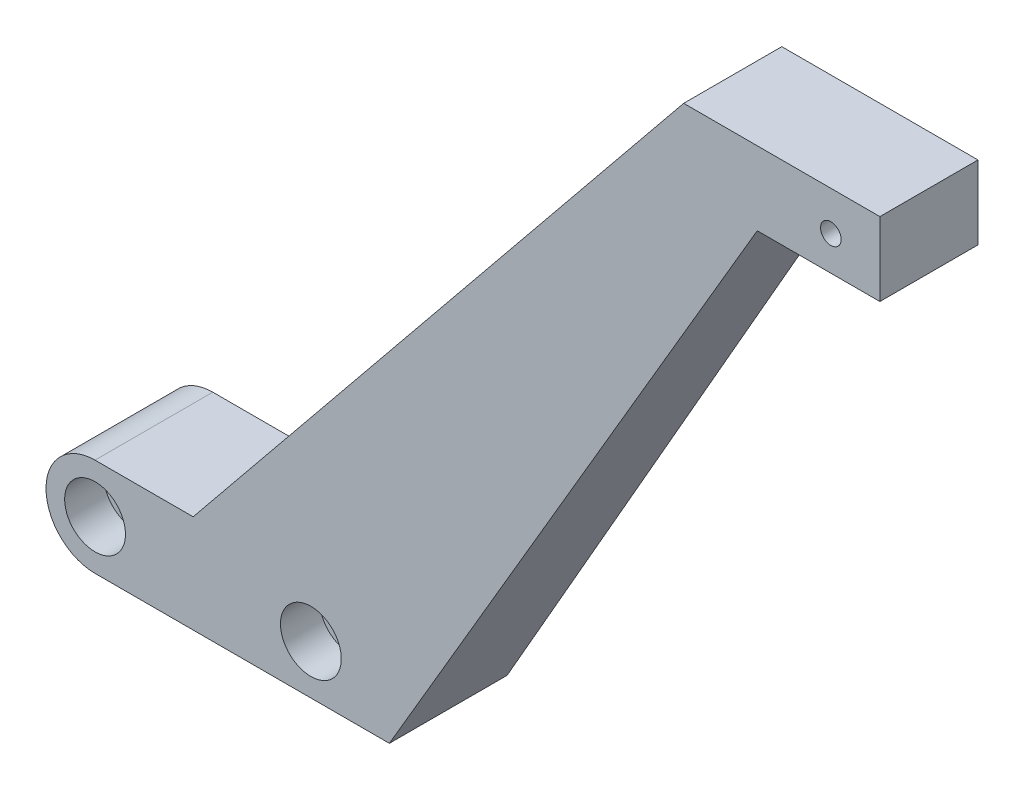
ISO-10303-21;
HEADER;
FILE_DESCRIPTION(('STEP AP214'),'2;1');
FILE_NAME('part.step','',(''),(''),'','','');
FILE_SCHEMA(('AUTOMOTIVE_DESIGN { 1 0 10303 214 1 1 1 1 }'));
ENDSEC;
DATA;
#1=APPLICATION_CONTEXT('core data for automotive mechanical design processes');
#2=APPLICATION_PROTOCOL_DEFINITION('international standard','automotive_design',2000,#1);
#3=PRODUCT_CONTEXT('',#1,'mechanical');
#4=PRODUCT('Part','Part','',(#3));
#5=PRODUCT_RELATED_PRODUCT_CATEGORY('part','',(#4));
#6=PRODUCT_DEFINITION_FORMATION('','',#4);
#7=PRODUCT_DEFINITION_CONTEXT('part definition',#1,'design');
#8=PRODUCT_DEFINITION('design','',#6,#7);
#9=PRODUCT_DEFINITION_SHAPE('','',#8);
#10=(LENGTH_UNIT() NAMED_UNIT(*) SI_UNIT(.MILLI.,.METRE.));
#11=(NAMED_UNIT(*) PLANE_ANGLE_UNIT() SI_UNIT($,.RADIAN.));
#12=(NAMED_UNIT(*) SI_UNIT($,.STERADIAN.) SOLID_ANGLE_UNIT());
#13=UNCERTAINTY_MEASURE_WITH_UNIT(LENGTH_MEASURE(1.E-05),#10,'distance_accuracy_value','');
#14=(GEOMETRIC_REPRESENTATION_CONTEXT(3) GLOBAL_UNCERTAINTY_ASSIGNED_CONTEXT((#13)) GLOBAL_UNIT_ASSIGNED_CONTEXT((#10,
#11,#12)) REPRESENTATION_CONTEXT('',''));
#15=CARTESIAN_POINT('',(0.,0.,0.));
#16=DIRECTION('',(0.,0.,1.));
#17=DIRECTION('',(1.,0.,0.));
#18=AXIS2_PLACEMENT_3D('',#15,#16,#17);
#19=CARTESIAN_POINT('',(-8.,0.,-10.5254833995939));
#20=DIRECTION('',(0.,0.,1.));
#21=DIRECTION('',(-1.,0.,0.));
#22=AXIS2_PLACEMENT_3D('',#19,#20,#21);
#23=CYLINDRICAL_SURFACE('',#22,1.6);
#24=CARTESIAN_POINT('',(-8.,0.,-6.));
#25=DIRECTION('',(0.,0.,1.));
#26=DIRECTION('',(1.,0.,0.));
#27=AXIS2_PLACEMENT_3D('',#24,#25,#26);
#28=CIRCLE('',#27,1.6);
#29=CARTESIAN_POINT('',(-6.4,0.,-6.));
#30=VERTEX_POINT('',#29);
#31=EDGE_CURVE('E429',#30,#30,#28,.F.);
#32=ORIENTED_EDGE('',*,*,#31,.T.);
#33=EDGE_LOOP('',(#32));
#34=FACE_BOUND('',#33,.T.);
#35=CARTESIAN_POINT('',(-8.,0.,2.));
#36=DIRECTION('',(0.,0.,-1.));
#37=DIRECTION('',(-1.,0.,0.));
#38=AXIS2_PLACEMENT_3D('',#35,#36,#37);
#39=CIRCLE('',#38,1.6);
#40=CARTESIAN_POINT('',(-9.60000000000001,0.,2.));
#41=VERTEX_POINT('',#40);
#42=EDGE_CURVE('E70',#41,#41,#39,.F.);
#43=ORIENTED_EDGE('',*,*,#42,.T.);
#44=EDGE_LOOP('',(#43));
#45=FACE_BOUND('',#44,.T.);
#46=ADVANCED_FACE('F66',(#34,#45),#23,.F.);
#47=CARTESIAN_POINT('',(-30.,0.,-10.5254833995939));
#48=DIRECTION('',(0.,0.,1.));
#49=DIRECTION('',(-1.,0.,0.));
#50=AXIS2_PLACEMENT_3D('',#47,#48,#49);
#51=CYLINDRICAL_SURFACE('',#50,1.6);
#52=CARTESIAN_POINT('',(-30.,0.,-6.));
#53=DIRECTION('',(0.,0.,1.));
#54=DIRECTION('',(1.,0.,0.));
#55=AXIS2_PLACEMENT_3D('',#52,#53,#54);
#56=CIRCLE('',#55,1.6);
#57=CARTESIAN_POINT('',(-28.4,0.,-6.));
#58=VERTEX_POINT('',#57);
#59=EDGE_CURVE('E327',#58,#58,#56,.F.);
#60=ORIENTED_EDGE('',*,*,#59,.T.);
#61=EDGE_LOOP('',(#60));
#62=FACE_BOUND('',#61,.T.);
#63=CARTESIAN_POINT('',(-30.,0.,2.));
#64=DIRECTION('',(0.,0.,-1.));
#65=DIRECTION('',(-1.,0.,0.));
#66=AXIS2_PLACEMENT_3D('',#63,#64,#65);
#67=CIRCLE('',#66,1.6);
#68=CARTESIAN_POINT('',(-31.6,0.,2.));
#69=VERTEX_POINT('',#68);
#70=EDGE_CURVE('E418',#69,#69,#67,.F.);
#71=ORIENTED_EDGE('',*,*,#70,.T.);
#72=EDGE_LOOP('',(#71));
#73=FACE_BOUND('',#72,.T.);
#74=ADVANCED_FACE('F379',(#62,#73),#51,.F.);
#75=CARTESIAN_POINT('',(-20.,-5.,6.));
#76=DIRECTION('',(0.,0.,1.));
#77=DIRECTION('',(-1.,0.,0.));
#78=AXIS2_PLACEMENT_3D('',#75,#76,#77);
#79=PLANE('',#78);
#80=CARTESIAN_POINT('',(-8.,0.,6.));
#81=DIRECTION('',(0.,0.,-1.));
#82=DIRECTION('',(-1.,0.,0.));
#83=AXIS2_PLACEMENT_3D('',#80,#81,#82);
#84=CIRCLE('',#83,3.1);
#85=CARTESIAN_POINT('',(-11.1,0.,6.));
#86=VERTEX_POINT('',#85);
#87=EDGE_CURVE('E432',#86,#86,#84,.T.);
#88=ORIENTED_EDGE('',*,*,#87,.T.);
#89=EDGE_LOOP('',(#88));
#90=FACE_BOUND('',#89,.T.);
#91=CARTESIAN_POINT('',(-30.,0.,6.));
#92=DIRECTION('',(0.,0.,-1.));
#93=DIRECTION('',(-1.,0.,0.));
#94=AXIS2_PLACEMENT_3D('',#91,#92,#93);
#95=CIRCLE('',#94,3.1);
#96=CARTESIAN_POINT('',(-33.1,0.,6.));
#97=VERTEX_POINT('',#96);
#98=EDGE_CURVE('E425',#97,#97,#95,.T.);
#99=ORIENTED_EDGE('',*,*,#98,.T.);
#100=EDGE_LOOP('',(#99));
#101=FACE_BOUND('',#100,.T.);
#102=CARTESIAN_POINT('',(45.,62.5,6.));
#103=DIRECTION('',(0.,0.,-1.));
#104=DIRECTION('',(-1.,0.,0.));
#105=AXIS2_PLACEMENT_3D('',#102,#103,#104);
#106=CIRCLE('',#105,1.05);
#107=CARTESIAN_POINT('',(43.95,62.5,6.));
#108=VERTEX_POINT('',#107);
#109=EDGE_CURVE('E161',#108,#108,#106,.T.);
#110=ORIENTED_EDGE('',*,*,#109,.T.);
#111=EDGE_LOOP('',(#110));
#112=FACE_BOUND('',#111,.T.);
#113=DIRECTION('',(1.,0.,0.));
#114=VECTOR('',#113,1.);
#115=CARTESIAN_POINT('',(-20.,-5.,6.));
#116=LINE('',#115,#114);
#117=CARTESIAN_POINT('',(-30.,-5.,6.));
#118=VERTEX_POINT('',#117);
#119=CARTESIAN_POINT('',(0.,-5.,6.));
#120=VERTEX_POINT('',#119);
#121=EDGE_CURVE('E244',#118,#120,#116,.T.);
#122=ORIENTED_EDGE('',*,*,#121,.T.);
#123=DIRECTION('',(0.505546500182335,0.862799360311186,0.));
#124=VECTOR('',#123,1.);
#125=CARTESIAN_POINT('',(0.,-5.,6.));
#126=LINE('',#125,#124);
#127=CARTESIAN_POINT('',(37.5,59.,6.));
#128=VERTEX_POINT('',#127);
#129=EDGE_CURVE('E339',#120,#128,#126,.T.);
#130=ORIENTED_EDGE('',*,*,#129,.T.);
#131=DIRECTION('',(-1.,0.,0.));
#132=VECTOR('',#131,1.);
#133=CARTESIAN_POINT('',(62.5,59.,6.));
#134=LINE('',#133,#132);
#135=CARTESIAN_POINT('',(50.,59.,6.));
#136=VERTEX_POINT('',#135);
#137=EDGE_CURVE('E303',#136,#128,#134,.T.);
#138=ORIENTED_EDGE('',*,*,#137,.F.);
#139=DIRECTION('',(0.,1.,0.));
#140=VECTOR('',#139,1.);
#141=CARTESIAN_POINT('',(50.,59.,6.));
#142=LINE('',#141,#140);
#143=CARTESIAN_POINT('',(50.,66.5,6.));
#144=VERTEX_POINT('',#143);
#145=EDGE_CURVE('E290',#136,#144,#142,.T.);
#146=ORIENTED_EDGE('',*,*,#145,.T.);
#147=DIRECTION('',(-1.,0.,0.));
#148=VECTOR('',#147,1.);
#149=CARTESIAN_POINT('',(62.5,66.5,6.));
#150=LINE('',#149,#148);
#151=CARTESIAN_POINT('',(30.,66.5,6.));
#152=VERTEX_POINT('',#151);
#153=EDGE_CURVE('E168',#144,#152,#150,.T.);
#154=ORIENTED_EDGE('',*,*,#153,.T.);
#155=DIRECTION('',(0.63083008454486,0.775921003990177,0.));
#156=VECTOR('',#155,1.);
#157=CARTESIAN_POINT('',(-20.,5.,6.));
#158=LINE('',#157,#156);
#159=CARTESIAN_POINT('',(-20.,5.,6.));
#160=VERTEX_POINT('',#159);
#161=EDGE_CURVE('E148',#160,#152,#158,.T.);
#162=ORIENTED_EDGE('',*,*,#161,.F.);
#163=DIRECTION('',(1.,0.,0.));
#164=VECTOR('',#163,1.);
#165=CARTESIAN_POINT('',(-35.,5.,6.));
#166=LINE('',#165,#164);
#167=CARTESIAN_POINT('',(-30.,5.,6.));
#168=VERTEX_POINT('',#167);
#169=EDGE_CURVE('E157',#168,#160,#166,.T.);
#170=ORIENTED_EDGE('',*,*,#169,.F.);
#171=CARTESIAN_POINT('',(-30.,0.,6.));
#172=DIRECTION('',(0.,0.,-1.));
#173=DIRECTION('',(-1.,0.,0.));
#174=AXIS2_PLACEMENT_3D('',#171,#172,#173);
#175=CIRCLE('',#174,5.);
#176=CARTESIAN_POINT('',(-35.,0.,6.));
#177=VERTEX_POINT('',#176);
#178=EDGE_CURVE('E410',#177,#168,#175,.T.);
#179=ORIENTED_EDGE('',*,*,#178,.F.);
#180=CARTESIAN_POINT('',(-30.,0.,6.));
#181=DIRECTION('',(0.,0.,-1.));
#182=DIRECTION('',(-1.,0.,0.));
#183=AXIS2_PLACEMENT_3D('',#180,#181,#182);
#184=CIRCLE('',#183,5.);
#185=EDGE_CURVE('E75',#118,#177,#184,.T.);
#186=ORIENTED_EDGE('',*,*,#185,.F.);
#187=EDGE_LOOP('',(#122,#130,#138,#146,#154,#162,#170,#179,#186));
#188=FACE_BOUND('',#187,.T.);
#189=ADVANCED_FACE('F165',(#90,#101,#112,#188),#79,.T.);
#190=CARTESIAN_POINT('',(-20.,-5.,-6.));
#191=DIRECTION('',(0.,-1.,0.));
#192=DIRECTION('',(0.,0.,1.));
#193=AXIS2_PLACEMENT_3D('',#190,#191,#192);
#194=PLANE('',#193);
#195=DIRECTION('',(1.,0.,0.));
#196=VECTOR('',#195,1.);
#197=CARTESIAN_POINT('',(-20.,-5.,-6.));
#198=LINE('',#197,#196);
#199=CARTESIAN_POINT('',(-30.,-5.,-6.));
#200=VERTEX_POINT('',#199);
#201=CARTESIAN_POINT('',(0.,-5.00000000000001,-6.));
#202=VERTEX_POINT('',#201);
#203=EDGE_CURVE('E321',#200,#202,#198,.T.);
#204=ORIENTED_EDGE('',*,*,#203,.T.);
#205=DIRECTION('',(0.,0.,-1.));
#206=VECTOR('',#205,1.);
#207=CARTESIAN_POINT('',(0.,-5.,0.));
#208=LINE('',#207,#206);
#209=EDGE_CURVE('E154',#202,#120,#208,.F.);
#210=ORIENTED_EDGE('',*,*,#209,.T.);
#211=ORIENTED_EDGE('',*,*,#121,.F.);
#212=DIRECTION('',(0.,0.,-1.));
#213=VECTOR('',#212,1.);
#214=CARTESIAN_POINT('',(-30.,-5.,-6.));
#215=LINE('',#214,#213);
#216=EDGE_CURVE('E412',#200,#118,#215,.F.);
#217=ORIENTED_EDGE('',*,*,#216,.F.);
#218=EDGE_LOOP('',(#204,#210,#211,#217));
#219=FACE_BOUND('',#218,.T.);
#220=ADVANCED_FACE('F214',(#219),#194,.T.);
#221=CARTESIAN_POINT('',(-20.,-5.,-6.));
#222=DIRECTION('',(0.,0.,-1.));
#223=DIRECTION('',(1.,0.,0.));
#224=AXIS2_PLACEMENT_3D('',#221,#222,#223);
#225=PLANE('',#224);
#226=ORIENTED_EDGE('',*,*,#31,.F.);
#227=EDGE_LOOP('',(#226));
#228=FACE_BOUND('',#227,.T.);
#229=ORIENTED_EDGE('',*,*,#59,.F.);
#230=EDGE_LOOP('',(#229));
#231=FACE_BOUND('',#230,.T.);
#232=CARTESIAN_POINT('',(-30.,0.,-6.));
#233=DIRECTION('',(0.,0.,1.));
#234=DIRECTION('',(1.,0.,0.));
#235=AXIS2_PLACEMENT_3D('',#232,#233,#234);
#236=CIRCLE('',#235,5.);
#237=CARTESIAN_POINT('',(-30.,5.00000000000001,-6.));
#238=VERTEX_POINT('',#237);
#239=CARTESIAN_POINT('',(-35.,0.,-6.));
#240=VERTEX_POINT('',#239);
#241=EDGE_CURVE('E325',#238,#240,#236,.T.);
#242=ORIENTED_EDGE('',*,*,#241,.F.);
#243=DIRECTION('',(1.,0.,0.));
#244=VECTOR('',#243,1.);
#245=CARTESIAN_POINT('',(-35.,5.00000000000001,-6.));
#246=LINE('',#245,#244);
#247=CARTESIAN_POINT('',(-20.,5.00000000000001,-6.));
#248=VERTEX_POINT('',#247);
#249=EDGE_CURVE('E162',#238,#248,#246,.T.);
#250=ORIENTED_EDGE('',*,*,#249,.T.);
#251=DIRECTION('',(1.,0.,0.));
#252=VECTOR('',#251,1.);
#253=CARTESIAN_POINT('',(-20.,5.,-6.));
#254=LINE('',#253,#252);
#255=CARTESIAN_POINT('',(0.,5.,-6.));
#256=VERTEX_POINT('',#255);
#257=EDGE_CURVE('E153',#248,#256,#254,.T.);
#258=ORIENTED_EDGE('',*,*,#257,.T.);
#259=DIRECTION('',(0.,1.,0.));
#260=VECTOR('',#259,1.);
#261=CARTESIAN_POINT('',(0.,-5.,-6.));
#262=LINE('',#261,#260);
#263=EDGE_CURVE('E314',#256,#202,#262,.F.);
#264=ORIENTED_EDGE('',*,*,#263,.T.);
#265=ORIENTED_EDGE('',*,*,#203,.F.);
#266=CARTESIAN_POINT('',(-30.,0.,-6.));
#267=DIRECTION('',(0.,0.,1.));
#268=DIRECTION('',(1.,0.,0.));
#269=AXIS2_PLACEMENT_3D('',#266,#267,#268);
#270=CIRCLE('',#269,5.);
#271=EDGE_CURVE('E415',#240,#200,#270,.T.);
#272=ORIENTED_EDGE('',*,*,#271,.F.);
#273=EDGE_LOOP('',(#242,#250,#258,#264,#265,#272));
#274=FACE_BOUND('',#273,.T.);
#275=ADVANCED_FACE('F202',(#228,#231,#274),#225,.T.);
#276=CARTESIAN_POINT('',(-20.,5.,-6.));
#277=CARTESIAN_POINT('',(30.,66.5,-4.));
#278=CARTESIAN_POINT('',(-16.6666666666667,5.,-6.));
#279=CARTESIAN_POINT('',(30.,65.2500000000001,-4.));
#280=CARTESIAN_POINT('',(-13.3333333333334,5.,-6.));
#281=CARTESIAN_POINT('',(30.,64.0000000000001,-4.));
#282=CARTESIAN_POINT('',(-6.66666666666669,5.,-6.));
#283=CARTESIAN_POINT('',(30.,61.5000000000001,-4.));
#284=CARTESIAN_POINT('',(-3.33333333333335,5.,-6.));
#285=CARTESIAN_POINT('',(30.,60.2500000000001,-4.));
#286=CARTESIAN_POINT('',(0.,5.,-6.));
#287=CARTESIAN_POINT('',(30.,59.,-4.));
#288=B_SPLINE_SURFACE_WITH_KNOTS('',3,1,((#276,#277),(#278,#279),(#280,#281),(#282,#283),(#284,
#285),(#286,#287)),.UNSPECIFIED.,.F.,.F.,.F.,(4,2,4),(2,2),(0.,0.5,1.),(0.,1.),.UNSPECIFIED.);
#289=DIRECTION('',(-0.630629351049608,-0.775674101791018,-0.0252251740419843));
#290=VECTOR('',#289,1.);
#291=CARTESIAN_POINT('',(5.,35.75,-5.));
#292=LINE('',#291,#290);
#293=CARTESIAN_POINT('',(30.,66.5,-4.));
#294=VERTEX_POINT('',#293);
#295=EDGE_CURVE('E151',#294,#248,#292,.T.);
#296=DIRECTION('',(0.,1.,0.));
#297=VECTOR('',#296,1.);
#298=CARTESIAN_POINT('',(30.,0.,-4.));
#299=LINE('',#298,#297);
#300=CARTESIAN_POINT('',(30.,59.,-4.));
#301=VERTEX_POINT('',#300);
#302=EDGE_CURVE('E172',#301,#294,#299,.T.);
#303=DIRECTION('',(0.48538860126793,0.873699482282274,0.0323592400845287));
#304=VECTOR('',#303,1.);
#305=CARTESIAN_POINT('',(15.,32.,-5.));
#306=LINE('',#305,#304);
#307=EDGE_CURVE('E170',#256,#301,#306,.T.);
#308=ORIENTED_EDGE('',*,*,#257,.F.);
#309=ORIENTED_EDGE('',*,*,#295,.F.);
#310=ORIENTED_EDGE('',*,*,#302,.F.);
#311=ORIENTED_EDGE('',*,*,#307,.F.);
#312=EDGE_LOOP('',(#308,#309,#310,#311));
#313=FACE_BOUND('',#312,.T.);
#314=ADVANCED_FACE('F190',(#313),#288,.F.);
#315=CARTESIAN_POINT('',(-14.4884396513988,11.7792192287795,0.));
#316=DIRECTION('',(-0.775921003990177,0.63083008454486,0.));
#317=DIRECTION('',(-0.63083008454486,-0.775921003990177,0.));
#318=AXIS2_PLACEMENT_3D('',#315,#316,#317);
#319=PLANE('',#318);
#320=ORIENTED_EDGE('',*,*,#295,.T.);
#321=DIRECTION('',(0.,0.,-1.));
#322=VECTOR('',#321,1.);
#323=CARTESIAN_POINT('',(-20.,5.00000000000001,0.));
#324=LINE('',#323,#322);
#325=EDGE_CURVE('E144',#160,#248,#324,.T.);
#326=ORIENTED_EDGE('',*,*,#325,.F.);
#327=ORIENTED_EDGE('',*,*,#161,.T.);
#328=DIRECTION('',(0.,0.,1.));
#329=VECTOR('',#328,1.);
#330=CARTESIAN_POINT('',(30.,66.5,0.));
#331=LINE('',#330,#329);
#332=EDGE_CURVE('E169',#294,#152,#331,.T.);
#333=ORIENTED_EDGE('',*,*,#332,.F.);
#334=EDGE_LOOP('',(#320,#326,#327,#333));
#335=FACE_BOUND('',#334,.T.);
#336=ADVANCED_FACE('F145',(#335),#319,.T.);
#337=CARTESIAN_POINT('',(62.5,66.5,-4.));
#338=DIRECTION('',(0.,0.,1.));
#339=DIRECTION('',(-1.,0.,0.));
#340=AXIS2_PLACEMENT_3D('',#337,#338,#339);
#341=PLANE('',#340);
#342=CARTESIAN_POINT('',(45.,62.5,-4.));
#343=DIRECTION('',(0.,0.,-1.));
#344=DIRECTION('',(-1.,0.,0.));
#345=AXIS2_PLACEMENT_3D('',#342,#343,#344);
#346=CIRCLE('',#345,1.05);
#347=CARTESIAN_POINT('',(43.95,62.5,-4.));
#348=VERTEX_POINT('',#347);
#349=EDGE_CURVE('E334',#348,#348,#346,.F.);
#350=ORIENTED_EDGE('',*,*,#349,.T.);
#351=EDGE_LOOP('',(#350));
#352=FACE_BOUND('',#351,.T.);
#353=DIRECTION('',(0.,-1.,0.));
#354=VECTOR('',#353,1.);
#355=CARTESIAN_POINT('',(50.,66.5,-4.));
#356=LINE('',#355,#354);
#357=CARTESIAN_POINT('',(50.,66.5,-4.));
#358=VERTEX_POINT('',#357);
#359=CARTESIAN_POINT('',(50.,59.,-4.));
#360=VERTEX_POINT('',#359);
#361=EDGE_CURVE('E294',#358,#360,#356,.T.);
#362=ORIENTED_EDGE('',*,*,#361,.T.);
#363=DIRECTION('',(-1.,0.,0.));
#364=VECTOR('',#363,1.);
#365=CARTESIAN_POINT('',(62.5,59.,-4.));
#366=LINE('',#365,#364);
#367=CARTESIAN_POINT('',(37.5,59.,-4.));
#368=VERTEX_POINT('',#367);
#369=EDGE_CURVE('E305',#360,#368,#366,.T.);
#370=ORIENTED_EDGE('',*,*,#369,.T.);
#371=DIRECTION('',(-1.,0.,0.));
#372=VECTOR('',#371,1.);
#373=CARTESIAN_POINT('',(30.,59.,-4.));
#374=LINE('',#373,#372);
#375=EDGE_CURVE('E272',#368,#301,#374,.T.);
#376=ORIENTED_EDGE('',*,*,#375,.T.);
#377=ORIENTED_EDGE('',*,*,#302,.T.);
#378=DIRECTION('',(-1.,0.,0.));
#379=VECTOR('',#378,1.);
#380=CARTESIAN_POINT('',(62.5,66.5,-4.));
#381=LINE('',#380,#379);
#382=EDGE_CURVE('E280',#358,#294,#381,.T.);
#383=ORIENTED_EDGE('',*,*,#382,.F.);
#384=EDGE_LOOP('',(#362,#370,#376,#377,#383));
#385=FACE_BOUND('',#384,.T.);
#386=ADVANCED_FACE('F213',(#352,#385),#341,.F.);
#387=CARTESIAN_POINT('',(62.5,59.,-4.));
#388=DIRECTION('',(0.,1.,0.));
#389=DIRECTION('',(0.,0.,-1.));
#390=AXIS2_PLACEMENT_3D('',#387,#388,#389);
#391=PLANE('',#390);
#392=ORIENTED_EDGE('',*,*,#369,.F.);
#393=DIRECTION('',(0.,0.,1.));
#394=VECTOR('',#393,1.);
#395=CARTESIAN_POINT('',(50.,59.,-4.));
#396=LINE('',#395,#394);
#397=EDGE_CURVE('E292',#360,#136,#396,.T.);
#398=ORIENTED_EDGE('',*,*,#397,.T.);
#399=ORIENTED_EDGE('',*,*,#137,.T.);
#400=DIRECTION('',(0.,0.,-1.));
#401=VECTOR('',#400,1.);
#402=CARTESIAN_POINT('',(37.5,59.,-4.));
#403=LINE('',#402,#401);
#404=EDGE_CURVE('E238',#128,#368,#403,.T.);
#405=ORIENTED_EDGE('',*,*,#404,.T.);
#406=EDGE_LOOP('',(#392,#398,#399,#405));
#407=FACE_BOUND('',#406,.T.);
#408=ADVANCED_FACE('F246',(#407),#391,.F.);
#409=CARTESIAN_POINT('',(62.5,66.5,6.));
#410=DIRECTION('',(0.,-1.,0.));
#411=DIRECTION('',(0.,0.,1.));
#412=AXIS2_PLACEMENT_3D('',#409,#410,#411);
#413=PLANE('',#412);
#414=DIRECTION('',(0.,0.,-1.));
#415=VECTOR('',#414,1.);
#416=CARTESIAN_POINT('',(50.,66.5,6.));
#417=LINE('',#416,#415);
#418=EDGE_CURVE('E297',#144,#358,#417,.T.);
#419=ORIENTED_EDGE('',*,*,#418,.T.);
#420=ORIENTED_EDGE('',*,*,#382,.T.);
#421=ORIENTED_EDGE('',*,*,#332,.T.);
#422=ORIENTED_EDGE('',*,*,#153,.F.);
#423=EDGE_LOOP('',(#419,#420,#421,#422));
#424=FACE_BOUND('',#423,.T.);
#425=ADVANCED_FACE('F254',(#424),#413,.F.);
#426=CARTESIAN_POINT('',(50.,0.,0.));
#427=DIRECTION('',(1.,0.,0.));
#428=DIRECTION('',(0.,0.,1.));
#429=AXIS2_PLACEMENT_3D('',#426,#427,#428);
#430=PLANE('',#429);
#431=ORIENTED_EDGE('',*,*,#418,.F.);
#432=ORIENTED_EDGE('',*,*,#145,.F.);
#433=ORIENTED_EDGE('',*,*,#397,.F.);
#434=ORIENTED_EDGE('',*,*,#361,.F.);
#435=EDGE_LOOP('',(#431,#432,#433,#434));
#436=FACE_BOUND('',#435,.T.);
#437=ADVANCED_FACE('F203',(#436),#430,.T.);
#438=CARTESIAN_POINT('',(0.,5.,-6.));
#439=CARTESIAN_POINT('',(30.,59.,-4.));
#440=CARTESIAN_POINT('',(0.,3.33333333333334,-6.));
#441=CARTESIAN_POINT('',(31.2500000000001,59.,-4.));
#442=CARTESIAN_POINT('',(0.,1.66666666666667,-6.));
#443=CARTESIAN_POINT('',(32.5000000000002,59.,-4.));
#444=CARTESIAN_POINT('',(0.,-1.66666666666666,-6.));
#445=CARTESIAN_POINT('',(35.0000000000002,59.,-4.));
#446=CARTESIAN_POINT('',(0.,-3.33333333333333,-6.));
#447=CARTESIAN_POINT('',(36.2500000000001,59.,-4.));
#448=CARTESIAN_POINT('',(0.,-5.,-6.));
#449=CARTESIAN_POINT('',(37.5,59.,-4.));
#450=B_SPLINE_SURFACE_WITH_KNOTS('',3,1,((#438,#439),(#440,#441),(#442,#443),(#444,#445),(#446,
#447),(#448,#449)),.UNSPECIFIED.,.F.,.F.,.F.,(4,2,4),(2,2),(0.,0.5,1.),(0.,1.),.UNSPECIFIED.);
#451=DIRECTION('',(0.505362840396907,0.862485914277388,0.0269526848211684));
#452=VECTOR('',#451,1.);
#453=CARTESIAN_POINT('',(18.75,27.,-5.));
#454=LINE('',#453,#452);
#455=EDGE_CURVE('E337',#202,#368,#454,.T.);
#456=ORIENTED_EDGE('',*,*,#263,.F.);
#457=ORIENTED_EDGE('',*,*,#307,.T.);
#458=ORIENTED_EDGE('',*,*,#375,.F.);
#459=ORIENTED_EDGE('',*,*,#455,.F.);
#460=EDGE_LOOP('',(#456,#457,#458,#459));
#461=FACE_BOUND('',#460,.T.);
#462=ADVANCED_FACE('F351',(#461),#450,.F.);
#463=CARTESIAN_POINT('',(2.18092598482439,-1.27788631923304,0.));
#464=DIRECTION('',(0.862799360311186,-0.505546500182336,0.));
#465=DIRECTION('',(0.505546500182335,0.862799360311186,0.));
#466=AXIS2_PLACEMENT_3D('',#463,#464,#465);
#467=PLANE('',#466);
#468=ORIENTED_EDGE('',*,*,#129,.F.);
#469=ORIENTED_EDGE('',*,*,#209,.F.);
#470=ORIENTED_EDGE('',*,*,#455,.T.);
#471=ORIENTED_EDGE('',*,*,#404,.F.);
#472=EDGE_LOOP('',(#468,#469,#470,#471));
#473=FACE_BOUND('',#472,.T.);
#474=ADVANCED_FACE('F362',(#473),#467,.T.);
#475=CARTESIAN_POINT('',(45.,62.5,-6.9698484809835));
#476=DIRECTION('',(0.,0.,1.));
#477=DIRECTION('',(-1.,0.,0.));
#478=AXIS2_PLACEMENT_3D('',#475,#476,#477);
#479=CYLINDRICAL_SURFACE('',#478,1.05);
#480=ORIENTED_EDGE('',*,*,#349,.F.);
#481=EDGE_LOOP('',(#480));
#482=FACE_BOUND('',#481,.T.);
#483=ORIENTED_EDGE('',*,*,#109,.F.);
#484=EDGE_LOOP('',(#483));
#485=FACE_BOUND('',#484,.T.);
#486=ADVANCED_FACE('F363',(#482,#485),#479,.F.);
#487=CARTESIAN_POINT('',(-35.,5.00000000000001,-6.));
#488=DIRECTION('',(0.,-1.,0.));
#489=DIRECTION('',(0.,0.,1.));
#490=AXIS2_PLACEMENT_3D('',#487,#488,#489);
#491=PLANE('',#490);
#492=ORIENTED_EDGE('',*,*,#169,.T.);
#493=ORIENTED_EDGE('',*,*,#325,.T.);
#494=ORIENTED_EDGE('',*,*,#249,.F.);
#495=DIRECTION('',(0.,0.,1.));
#496=VECTOR('',#495,1.);
#497=CARTESIAN_POINT('',(-30.,5.00000000000001,-6.));
#498=LINE('',#497,#496);
#499=EDGE_CURVE('E14',#168,#238,#498,.F.);
#500=ORIENTED_EDGE('',*,*,#499,.F.);
#501=EDGE_LOOP('',(#492,#493,#494,#500));
#502=FACE_BOUND('',#501,.T.);
#503=ADVANCED_FACE('F158',(#502),#491,.F.);
#504=CARTESIAN_POINT('',(-30.,0.,0.));
#505=DIRECTION('',(0.,0.,-1.));
#506=DIRECTION('',(0.,-1.,0.));
#507=AXIS2_PLACEMENT_3D('',#504,#505,#506);
#508=CYLINDRICAL_SURFACE('',#507,5.);
#509=ORIENTED_EDGE('',*,*,#499,.T.);
#510=ORIENTED_EDGE('',*,*,#241,.T.);
#511=DIRECTION('',(0.,0.,1.));
#512=VECTOR('',#511,1.);
#513=CARTESIAN_POINT('',(-35.,0.,6.));
#514=LINE('',#513,#512);
#515=EDGE_CURVE('E88',#240,#177,#514,.T.);
#516=ORIENTED_EDGE('',*,*,#515,.T.);
#517=ORIENTED_EDGE('',*,*,#178,.T.);
#518=EDGE_LOOP('',(#509,#510,#516,#517));
#519=FACE_BOUND('',#518,.T.);
#520=ADVANCED_FACE('F68',(#519),#508,.T.);
#521=CARTESIAN_POINT('',(-30.,0.,0.));
#522=DIRECTION('',(0.,0.,-1.));
#523=DIRECTION('',(1.,0.,0.));
#524=AXIS2_PLACEMENT_3D('',#521,#522,#523);
#525=CYLINDRICAL_SURFACE('',#524,5.);
#526=ORIENTED_EDGE('',*,*,#185,.T.);
#527=ORIENTED_EDGE('',*,*,#515,.F.);
#528=ORIENTED_EDGE('',*,*,#271,.T.);
#529=ORIENTED_EDGE('',*,*,#216,.T.);
#530=EDGE_LOOP('',(#526,#527,#528,#529));
#531=FACE_BOUND('',#530,.T.);
#532=ADVANCED_FACE('F397',(#531),#525,.T.);
#533=CARTESIAN_POINT('',(-30.,0.,2.));
#534=DIRECTION('',(0.,0.,1.));
#535=DIRECTION('',(-1.,0.,0.));
#536=AXIS2_PLACEMENT_3D('',#533,#534,#535);
#537=PLANE('',#536);
#538=CARTESIAN_POINT('',(-30.,0.,2.));
#539=DIRECTION('',(0.,0.,-1.));
#540=DIRECTION('',(-1.,0.,0.));
#541=AXIS2_PLACEMENT_3D('',#538,#539,#540);
#542=CIRCLE('',#541,3.1);
#543=CARTESIAN_POINT('',(-33.1,0.,2.));
#544=VERTEX_POINT('',#543);
#545=EDGE_CURVE('E420',#544,#544,#542,.T.);
#546=ORIENTED_EDGE('',*,*,#545,.F.);
#547=EDGE_LOOP('',(#546));
#548=FACE_BOUND('',#547,.T.);
#549=ORIENTED_EDGE('',*,*,#70,.F.);
#550=EDGE_LOOP('',(#549));
#551=FACE_BOUND('',#550,.T.);
#552=ADVANCED_FACE('F393',(#548,#551),#537,.T.);
#553=CARTESIAN_POINT('',(-30.,0.,2.));
#554=DIRECTION('',(0.,0.,1.));
#555=DIRECTION('',(-1.,0.,0.));
#556=AXIS2_PLACEMENT_3D('',#553,#554,#555);
#557=CYLINDRICAL_SURFACE('',#556,3.1);
#558=ORIENTED_EDGE('',*,*,#545,.T.);
#559=EDGE_LOOP('',(#558));
#560=FACE_BOUND('',#559,.T.);
#561=ORIENTED_EDGE('',*,*,#98,.F.);
#562=EDGE_LOOP('',(#561));
#563=FACE_BOUND('',#562,.T.);
#564=ADVANCED_FACE('F396',(#560,#563),#557,.F.);
#565=CARTESIAN_POINT('',(-8.,0.,2.));
#566=DIRECTION('',(0.,0.,1.));
#567=DIRECTION('',(-1.,0.,0.));
#568=AXIS2_PLACEMENT_3D('',#565,#566,#567);
#569=PLANE('',#568);
#570=CARTESIAN_POINT('',(-8.,0.,2.));
#571=DIRECTION('',(0.,0.,-1.));
#572=DIRECTION('',(-1.,0.,0.));
#573=AXIS2_PLACEMENT_3D('',#570,#571,#572);
#574=CIRCLE('',#573,3.1);
#575=CARTESIAN_POINT('',(-11.1,0.,2.));
#576=VERTEX_POINT('',#575);
#577=EDGE_CURVE('E435',#576,#576,#574,.T.);
#578=ORIENTED_EDGE('',*,*,#577,.F.);
#579=EDGE_LOOP('',(#578));
#580=FACE_BOUND('',#579,.T.);
#581=ORIENTED_EDGE('',*,*,#42,.F.);
#582=EDGE_LOOP('',(#581));
#583=FACE_BOUND('',#582,.T.);
#584=ADVANCED_FACE('F400',(#580,#583),#569,.T.);
#585=CARTESIAN_POINT('',(-8.,0.,2.));
#586=DIRECTION('',(0.,0.,1.));
#587=DIRECTION('',(-1.,0.,0.));
#588=AXIS2_PLACEMENT_3D('',#585,#586,#587);
#589=CYLINDRICAL_SURFACE('',#588,3.1);
#590=ORIENTED_EDGE('',*,*,#577,.T.);
#591=EDGE_LOOP('',(#590));
#592=FACE_BOUND('',#591,.T.);
#593=ORIENTED_EDGE('',*,*,#87,.F.);
#594=EDGE_LOOP('',(#593));
#595=FACE_BOUND('',#594,.T.);
#596=ADVANCED_FACE('F391',(#592,#595),#589,.F.);
#597=CLOSED_SHELL('',(#46,#74,#189,#220,#275,#314,#336,#386,#408,#425,#437,#462,#474,#486,#503,
#520,#532,#552,#564,#584,#596));
#598=MANIFOLD_SOLID_BREP('B2',#597);
#599=ADVANCED_BREP_SHAPE_REPRESENTATION('',(#18,#598),#14);
#600=SHAPE_DEFINITION_REPRESENTATION(#9,#599);
ENDSEC;
END-ISO-10303-21;
